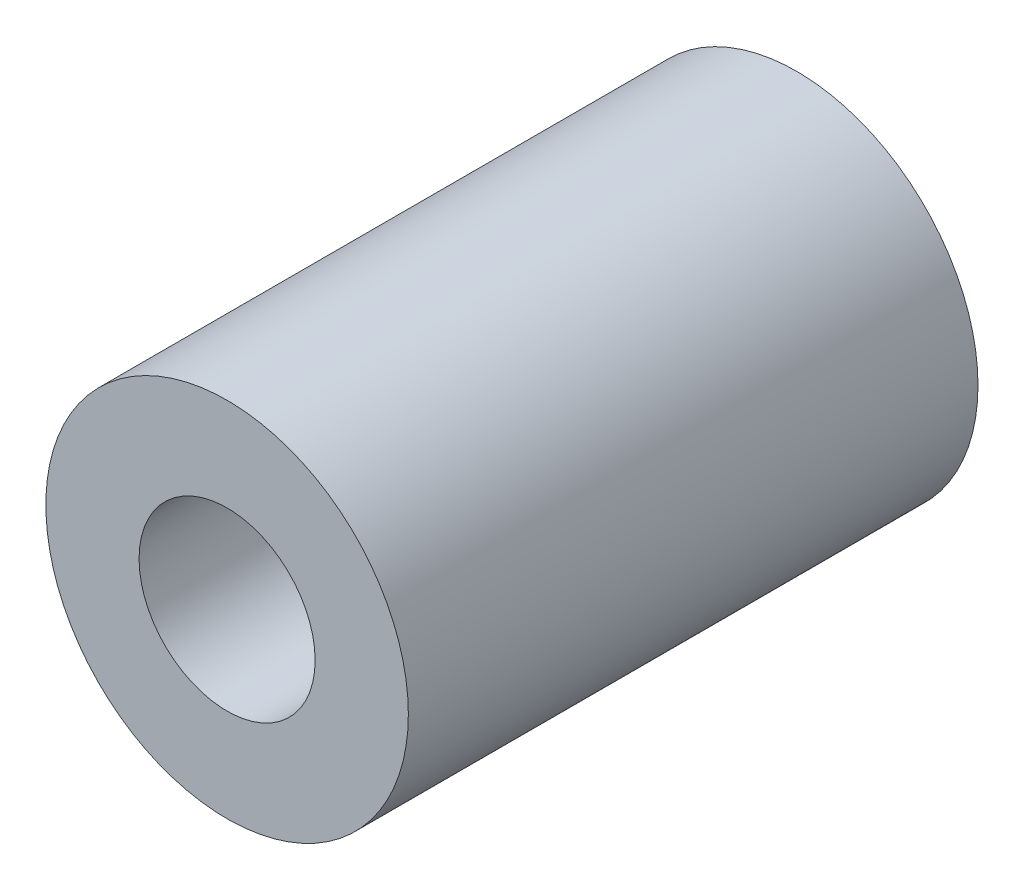
ISO-10303-21;
HEADER;
FILE_DESCRIPTION(('STEP AP214'),'2;1');
FILE_NAME('part.step','',(''),(''),'','','');
FILE_SCHEMA(('AUTOMOTIVE_DESIGN { 1 0 10303 214 1 1 1 1 }'));
ENDSEC;
DATA;
#1=APPLICATION_CONTEXT('core data for automotive mechanical design processes');
#2=APPLICATION_PROTOCOL_DEFINITION('international standard','automotive_design',2000,#1);
#3=PRODUCT_CONTEXT('',#1,'mechanical');
#4=PRODUCT('Part','Part','',(#3));
#5=PRODUCT_RELATED_PRODUCT_CATEGORY('part','',(#4));
#6=PRODUCT_DEFINITION_FORMATION('','',#4);
#7=PRODUCT_DEFINITION_CONTEXT('part definition',#1,'design');
#8=PRODUCT_DEFINITION('design','',#6,#7);
#9=PRODUCT_DEFINITION_SHAPE('','',#8);
#10=(LENGTH_UNIT() NAMED_UNIT(*) SI_UNIT(.MILLI.,.METRE.));
#11=(NAMED_UNIT(*) PLANE_ANGLE_UNIT() SI_UNIT($,.RADIAN.));
#12=(NAMED_UNIT(*) SI_UNIT($,.STERADIAN.) SOLID_ANGLE_UNIT());
#13=UNCERTAINTY_MEASURE_WITH_UNIT(LENGTH_MEASURE(1.E-05),#10,'distance_accuracy_value','');
#14=(GEOMETRIC_REPRESENTATION_CONTEXT(3) GLOBAL_UNCERTAINTY_ASSIGNED_CONTEXT((#13)) GLOBAL_UNIT_ASSIGNED_CONTEXT((#10,
#11,#12)) REPRESENTATION_CONTEXT('',''));
#15=CARTESIAN_POINT('',(0.,0.,0.));
#16=DIRECTION('',(0.,0.,1.));
#17=DIRECTION('',(1.,0.,0.));
#18=AXIS2_PLACEMENT_3D('',#15,#16,#17);
#19=CARTESIAN_POINT('',(0.,0.,11.));
#20=DIRECTION('',(0.,0.,1.));
#21=DIRECTION('',(1.,0.,0.));
#22=AXIS2_PLACEMENT_3D('',#19,#20,#21);
#23=PLANE('',#22);
#24=CARTESIAN_POINT('',(0.,0.,11.));
#25=DIRECTION('',(0.,0.,1.));
#26=DIRECTION('',(1.,0.,0.));
#27=AXIS2_PLACEMENT_3D('',#24,#25,#26);
#28=CIRCLE('',#27,3.5);
#29=CARTESIAN_POINT('',(3.5,0.,11.));
#30=VERTEX_POINT('',#29);
#31=EDGE_CURVE('E10',#30,#30,#28,.T.);
#32=ORIENTED_EDGE('',*,*,#31,.T.);
#33=EDGE_LOOP('',(#32));
#34=FACE_BOUND('',#33,.T.);
#35=CARTESIAN_POINT('',(0.,0.,11.));
#36=DIRECTION('',(0.,0.,1.));
#37=DIRECTION('',(1.,0.,0.));
#38=AXIS2_PLACEMENT_3D('',#35,#36,#37);
#39=CIRCLE('',#38,1.7);
#40=CARTESIAN_POINT('',(1.7,0.,11.));
#41=VERTEX_POINT('',#40);
#42=EDGE_CURVE('E45',#41,#41,#39,.T.);
#43=ORIENTED_EDGE('',*,*,#42,.F.);
#44=EDGE_LOOP('',(#43));
#45=FACE_BOUND('',#44,.T.);
#46=ADVANCED_FACE('F34',(#34,#45),#23,.T.);
#47=CARTESIAN_POINT('',(0.,0.,0.));
#48=DIRECTION('',(0.,0.,1.));
#49=DIRECTION('',(1.,0.,0.));
#50=AXIS2_PLACEMENT_3D('',#47,#48,#49);
#51=PLANE('',#50);
#52=CARTESIAN_POINT('',(0.,0.,0.));
#53=DIRECTION('',(0.,0.,1.));
#54=DIRECTION('',(1.,0.,0.));
#55=AXIS2_PLACEMENT_3D('',#52,#53,#54);
#56=CIRCLE('',#55,3.5);
#57=CARTESIAN_POINT('',(3.5,0.,0.));
#58=VERTEX_POINT('',#57);
#59=EDGE_CURVE('E38',#58,#58,#56,.T.);
#60=ORIENTED_EDGE('',*,*,#59,.F.);
#61=EDGE_LOOP('',(#60));
#62=FACE_BOUND('',#61,.T.);
#63=CARTESIAN_POINT('',(0.,0.,0.));
#64=DIRECTION('',(0.,0.,1.));
#65=DIRECTION('',(1.,0.,0.));
#66=AXIS2_PLACEMENT_3D('',#63,#64,#65);
#67=CIRCLE('',#66,1.7);
#68=CARTESIAN_POINT('',(1.7,0.,0.));
#69=VERTEX_POINT('',#68);
#70=EDGE_CURVE('E47',#69,#69,#67,.T.);
#71=ORIENTED_EDGE('',*,*,#70,.T.);
#72=EDGE_LOOP('',(#71));
#73=FACE_BOUND('',#72,.T.);
#74=ADVANCED_FACE('F57',(#62,#73),#51,.F.);
#75=CARTESIAN_POINT('',(0.,0.,11.));
#76=DIRECTION('',(0.,0.,-1.));
#77=DIRECTION('',(-1.,0.,0.));
#78=AXIS2_PLACEMENT_3D('',#75,#76,#77);
#79=CYLINDRICAL_SURFACE('',#78,3.5);
#80=ORIENTED_EDGE('',*,*,#31,.F.);
#81=EDGE_LOOP('',(#80));
#82=FACE_BOUND('',#81,.T.);
#83=ORIENTED_EDGE('',*,*,#59,.T.);
#84=EDGE_LOOP('',(#83));
#85=FACE_BOUND('',#84,.T.);
#86=ADVANCED_FACE('F36',(#82,#85),#79,.T.);
#87=CARTESIAN_POINT('',(0.,0.,11.));
#88=DIRECTION('',(0.,0.,-1.));
#89=DIRECTION('',(-1.,0.,0.));
#90=AXIS2_PLACEMENT_3D('',#87,#88,#89);
#91=CYLINDRICAL_SURFACE('',#90,1.7);
#92=ORIENTED_EDGE('',*,*,#42,.T.);
#93=EDGE_LOOP('',(#92));
#94=FACE_BOUND('',#93,.T.);
#95=ORIENTED_EDGE('',*,*,#70,.F.);
#96=EDGE_LOOP('',(#95));
#97=FACE_BOUND('',#96,.T.);
#98=ADVANCED_FACE('F53',(#94,#97),#91,.F.);
#99=CLOSED_SHELL('',(#46,#74,#86,#98));
#100=MANIFOLD_SOLID_BREP('B2',#99);
#101=ADVANCED_BREP_SHAPE_REPRESENTATION('',(#18,#100),#14);
#102=SHAPE_DEFINITION_REPRESENTATION(#9,#101);
ENDSEC;
END-ISO-10303-21;
